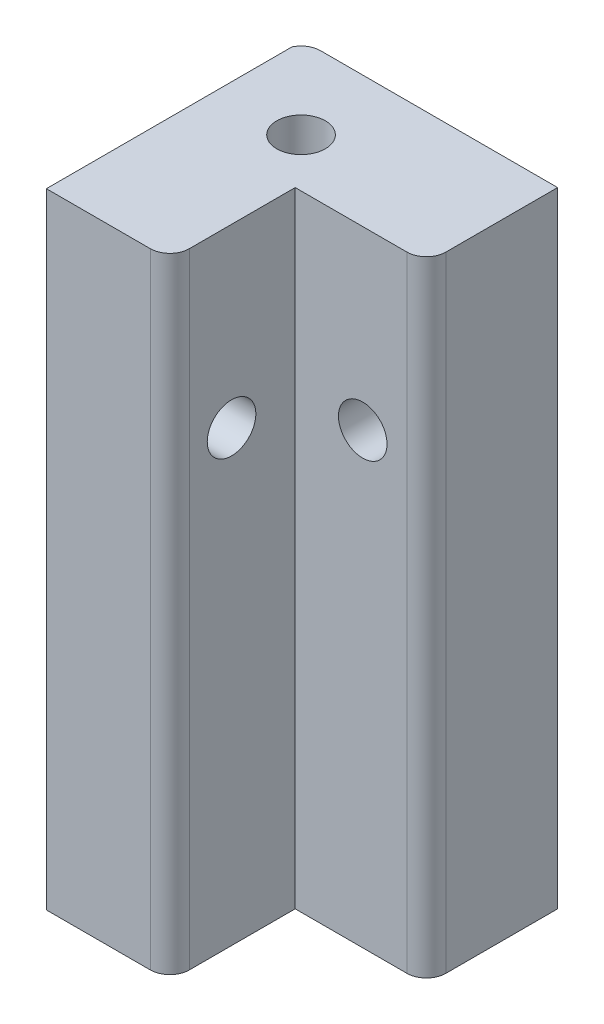
ISO-10303-21;
HEADER;
FILE_DESCRIPTION(('STEP AP214'),'2;1');
FILE_NAME('part.step','',(''),(''),'','','');
FILE_SCHEMA(('AUTOMOTIVE_DESIGN { 1 0 10303 214 1 1 1 1 }'));
ENDSEC;
DATA;
#1=APPLICATION_CONTEXT('core data for automotive mechanical design processes');
#2=APPLICATION_PROTOCOL_DEFINITION('international standard','automotive_design',2000,#1);
#3=PRODUCT_CONTEXT('',#1,'mechanical');
#4=PRODUCT('Part','Part','',(#3));
#5=PRODUCT_RELATED_PRODUCT_CATEGORY('part','',(#4));
#6=PRODUCT_DEFINITION_FORMATION('','',#4);
#7=PRODUCT_DEFINITION_CONTEXT('part definition',#1,'design');
#8=PRODUCT_DEFINITION('design','',#6,#7);
#9=PRODUCT_DEFINITION_SHAPE('','',#8);
#10=(LENGTH_UNIT() NAMED_UNIT(*) SI_UNIT(.MILLI.,.METRE.));
#11=(NAMED_UNIT(*) PLANE_ANGLE_UNIT() SI_UNIT($,.RADIAN.));
#12=(NAMED_UNIT(*) SI_UNIT($,.STERADIAN.) SOLID_ANGLE_UNIT());
#13=UNCERTAINTY_MEASURE_WITH_UNIT(LENGTH_MEASURE(1.E-05),#10,'distance_accuracy_value','');
#14=(GEOMETRIC_REPRESENTATION_CONTEXT(3) GLOBAL_UNCERTAINTY_ASSIGNED_CONTEXT((#13)) GLOBAL_UNIT_ASSIGNED_CONTEXT((#10,
#11,#12)) REPRESENTATION_CONTEXT('',''));
#15=CARTESIAN_POINT('',(0.,0.,0.));
#16=DIRECTION('',(0.,0.,1.));
#17=DIRECTION('',(1.,0.,0.));
#18=AXIS2_PLACEMENT_3D('',#15,#16,#17);
#19=CARTESIAN_POINT('',(4.4,82.5133549546154,-8.5));
#20=DIRECTION('',(-1.,0.,0.));
#21=DIRECTION('',(0.,0.,1.));
#22=AXIS2_PLACEMENT_3D('',#19,#20,#21);
#23=PLANE('',#22);
#24=CARTESIAN_POINT('',(4.4,46.1350000000003,11.55));
#25=DIRECTION('',(-1.,0.,0.));
#26=DIRECTION('',(0.,0.,1.));
#27=AXIS2_PLACEMENT_3D('',#24,#25,#26);
#28=CIRCLE('',#27,2.5);
#29=CARTESIAN_POINT('',(4.4,46.1350000000003,14.05));
#30=VERTEX_POINT('',#29);
#31=EDGE_CURVE('E128',#30,#30,#28,.T.);
#32=ORIENTED_EDGE('',*,*,#31,.T.);
#33=EDGE_LOOP('',(#32));
#34=FACE_BOUND('',#33,.T.);
#35=DIRECTION('',(0.,-1.,0.));
#36=VECTOR('',#35,1.);
#37=CARTESIAN_POINT('',(4.4,64.2700000000025,5.));
#38=LINE('',#37,#36);
#39=CARTESIAN_POINT('',(4.4,64.2700000000025,5.));
#40=VERTEX_POINT('',#39);
#41=CARTESIAN_POINT('',(4.4,0.,4.99999999999999));
#42=VERTEX_POINT('',#41);
#43=EDGE_CURVE('E181',#40,#42,#38,.T.);
#44=ORIENTED_EDGE('',*,*,#43,.F.);
#45=DIRECTION('',(0.,0.,1.));
#46=VECTOR('',#45,1.);
#47=CARTESIAN_POINT('',(4.4,64.2700000000025,-8.50000000000006));
#48=LINE('',#47,#46);
#49=CARTESIAN_POINT('',(4.4,64.2700000000024,15.9));
#50=VERTEX_POINT('',#49);
#51=EDGE_CURVE('E145',#40,#50,#48,.T.);
#52=ORIENTED_EDGE('',*,*,#51,.T.);
#53=DIRECTION('',(0.,1.,0.));
#54=VECTOR('',#53,1.);
#55=CARTESIAN_POINT('',(4.4,82.5133549546154,15.9));
#56=LINE('',#55,#54);
#57=CARTESIAN_POINT('',(4.4,0.,15.9));
#58=VERTEX_POINT('',#57);
#59=EDGE_CURVE('E160',#50,#58,#56,.F.);
#60=ORIENTED_EDGE('',*,*,#59,.T.);
#61=DIRECTION('',(0.,0.,-1.));
#62=VECTOR('',#61,1.);
#63=CARTESIAN_POINT('',(4.4,0.,-8.5));
#64=LINE('',#63,#62);
#65=EDGE_CURVE('E142',#58,#42,#64,.T.);
#66=ORIENTED_EDGE('',*,*,#65,.T.);
#67=EDGE_LOOP('',(#44,#52,#60,#66));
#68=FACE_BOUND('',#67,.T.);
#69=ADVANCED_FACE('F34',(#34,#68),#23,.F.);
#70=CARTESIAN_POINT('',(0.,0.,0.));
#71=DIRECTION('',(0.,-1.,0.));
#72=DIRECTION('',(0.,0.,-1.));
#73=AXIS2_PLACEMENT_3D('',#70,#71,#72);
#74=PLANE('',#73);
#75=DIRECTION('',(0.,0.,-1.));
#76=VECTOR('',#75,1.);
#77=CARTESIAN_POINT('',(-8.29999999999978,0.,17.8999999999997));
#78=LINE('',#77,#76);
#79=CARTESIAN_POINT('',(-8.29999999999978,0.,17.8999999999998));
#80=VERTEX_POINT('',#79);
#81=CARTESIAN_POINT('',(-8.29999999999978,0.,-7.37177978870845));
#82=VERTEX_POINT('',#81);
#83=EDGE_CURVE('E103',#80,#82,#78,.T.);
#84=ORIENTED_EDGE('',*,*,#83,.T.);
#85=CARTESIAN_POINT('',(-6.5,0.,-6.5));
#86=DIRECTION('',(0.,-1.,0.));
#87=DIRECTION('',(0.,0.,-1.));
#88=AXIS2_PLACEMENT_3D('',#85,#86,#87);
#89=CIRCLE('',#88,2.);
#90=CARTESIAN_POINT('',(-6.5,0.,-8.5));
#91=VERTEX_POINT('',#90);
#92=EDGE_CURVE('E162',#82,#91,#89,.T.);
#93=ORIENTED_EDGE('',*,*,#92,.T.);
#94=DIRECTION('',(-1.,0.,0.));
#95=VECTOR('',#94,1.);
#96=CARTESIAN_POINT('',(-8.5,0.,-8.5));
#97=LINE('',#96,#95);
#98=CARTESIAN_POINT('',(17.9,0.,-8.5));
#99=VERTEX_POINT('',#98);
#100=EDGE_CURVE('E137',#99,#91,#97,.T.);
#101=ORIENTED_EDGE('',*,*,#100,.F.);
#102=DIRECTION('',(0.,0.,-1.));
#103=VECTOR('',#102,1.);
#104=CARTESIAN_POINT('',(17.9,0.,-8.5));
#105=LINE('',#104,#103);
#106=CARTESIAN_POINT('',(17.9,0.,2.99999999999999));
#107=VERTEX_POINT('',#106);
#108=EDGE_CURVE('E175',#107,#99,#105,.T.);
#109=ORIENTED_EDGE('',*,*,#108,.F.);
#110=CARTESIAN_POINT('',(15.9,0.,2.99999999999999));
#111=DIRECTION('',(0.,-1.,0.));
#112=DIRECTION('',(0.,0.,-1.));
#113=AXIS2_PLACEMENT_3D('',#110,#111,#112);
#114=CIRCLE('',#113,2.);
#115=CARTESIAN_POINT('',(15.9,0.,4.99999999999999));
#116=VERTEX_POINT('',#115);
#117=EDGE_CURVE('E170',#107,#116,#114,.T.);
#118=ORIENTED_EDGE('',*,*,#117,.T.);
#119=DIRECTION('',(-1.,0.,0.));
#120=VECTOR('',#119,1.);
#121=CARTESIAN_POINT('',(17.9,0.,4.99999999999999));
#122=LINE('',#121,#120);
#123=EDGE_CURVE('E173',#116,#42,#122,.T.);
#124=ORIENTED_EDGE('',*,*,#123,.T.);
#125=ORIENTED_EDGE('',*,*,#65,.F.);
#126=CARTESIAN_POINT('',(2.4,0.,15.9));
#127=DIRECTION('',(0.,-1.,0.));
#128=DIRECTION('',(0.,0.,-1.));
#129=AXIS2_PLACEMENT_3D('',#126,#127,#128);
#130=CIRCLE('',#129,2.);
#131=CARTESIAN_POINT('',(2.4,0.,17.9));
#132=VERTEX_POINT('',#131);
#133=EDGE_CURVE('E126',#58,#132,#130,.T.);
#134=ORIENTED_EDGE('',*,*,#133,.T.);
#135=DIRECTION('',(1.,0.,0.));
#136=VECTOR('',#135,1.);
#137=CARTESIAN_POINT('',(4.4,0.,17.9));
#138=LINE('',#137,#136);
#139=EDGE_CURVE('E117',#80,#132,#138,.T.);
#140=ORIENTED_EDGE('',*,*,#139,.F.);
#141=EDGE_LOOP('',(#84,#93,#101,#109,#118,#124,#125,#134,#140));
#142=FACE_BOUND('',#141,.T.);
#143=CARTESIAN_POINT('',(0.,0.,0.));
#144=DIRECTION('',(0.,1.,0.));
#145=DIRECTION('',(0.,0.,1.));
#146=AXIS2_PLACEMENT_3D('',#143,#144,#145);
#147=CIRCLE('',#146,2.5);
#148=CARTESIAN_POINT('',(0.,0.,2.5));
#149=VERTEX_POINT('',#148);
#150=EDGE_CURVE('E130',#149,#149,#147,.T.);
#151=ORIENTED_EDGE('',*,*,#150,.T.);
#152=EDGE_LOOP('',(#151));
#153=FACE_BOUND('',#152,.T.);
#154=ADVANCED_FACE('F122',(#142,#153),#74,.T.);
#155=CARTESIAN_POINT('',(-8.5,82.5133549546154,-8.5));
#156=DIRECTION('',(0.,0.,1.));
#157=DIRECTION('',(1.,0.,0.));
#158=AXIS2_PLACEMENT_3D('',#155,#156,#157);
#159=PLANE('',#158);
#160=CARTESIAN_POINT('',(11.35,46.1350000000025,-8.5));
#161=DIRECTION('',(0.,0.,-1.));
#162=DIRECTION('',(-1.,0.,0.));
#163=AXIS2_PLACEMENT_3D('',#160,#161,#162);
#164=CIRCLE('',#163,2.5);
#165=CARTESIAN_POINT('',(8.85,46.1350000000025,-8.5));
#166=VERTEX_POINT('',#165);
#167=EDGE_CURVE('E211',#166,#166,#164,.T.);
#168=ORIENTED_EDGE('',*,*,#167,.F.);
#169=EDGE_LOOP('',(#168));
#170=FACE_BOUND('',#169,.T.);
#171=ORIENTED_EDGE('',*,*,#100,.T.);
#172=DIRECTION('',(0.,-1.,0.));
#173=VECTOR('',#172,1.);
#174=CARTESIAN_POINT('',(-6.5,82.5133549546154,-8.5));
#175=LINE('',#174,#173);
#176=CARTESIAN_POINT('',(-6.5,64.2700000000025,-8.5));
#177=VERTEX_POINT('',#176);
#178=EDGE_CURVE('E165',#91,#177,#175,.F.);
#179=ORIENTED_EDGE('',*,*,#178,.T.);
#180=DIRECTION('',(1.,0.,0.));
#181=VECTOR('',#180,1.);
#182=CARTESIAN_POINT('',(-8.49999999999994,64.2700000000025,-8.5));
#183=LINE('',#182,#181);
#184=CARTESIAN_POINT('',(17.9,64.2700000000025,-8.5));
#185=VERTEX_POINT('',#184);
#186=EDGE_CURVE('E141',#177,#185,#183,.T.);
#187=ORIENTED_EDGE('',*,*,#186,.T.);
#188=DIRECTION('',(0.,1.,0.));
#189=VECTOR('',#188,1.);
#190=CARTESIAN_POINT('',(17.9,64.2700000000025,-8.5));
#191=LINE('',#190,#189);
#192=EDGE_CURVE('E195',#99,#185,#191,.T.);
#193=ORIENTED_EDGE('',*,*,#192,.F.);
#194=EDGE_LOOP('',(#171,#179,#187,#193));
#195=FACE_BOUND('',#194,.T.);
#196=ADVANCED_FACE('F233',(#170,#195),#159,.F.);
#197=CARTESIAN_POINT('',(0.,82.5133549546154,0.));
#198=DIRECTION('',(0.,-1.,0.));
#199=DIRECTION('',(0.,0.,-1.));
#200=AXIS2_PLACEMENT_3D('',#197,#198,#199);
#201=CYLINDRICAL_SURFACE('',#200,2.5);
#202=CARTESIAN_POINT('',(0.,64.2700000000025,0.));
#203=DIRECTION('',(0.,-1.,0.));
#204=DIRECTION('',(0.,0.,-1.));
#205=AXIS2_PLACEMENT_3D('',#202,#203,#204);
#206=CIRCLE('',#205,2.5);
#207=CARTESIAN_POINT('',(0.,64.2700000000025,-2.5));
#208=VERTEX_POINT('',#207);
#209=EDGE_CURVE('E140',#208,#208,#206,.T.);
#210=ORIENTED_EDGE('',*,*,#209,.F.);
#211=EDGE_LOOP('',(#210));
#212=FACE_BOUND('',#211,.T.);
#213=ORIENTED_EDGE('',*,*,#150,.F.);
#214=EDGE_LOOP('',(#213));
#215=FACE_BOUND('',#214,.T.);
#216=ADVANCED_FACE('F237',(#212,#215),#201,.F.);
#217=CARTESIAN_POINT('',(-5.03553390591879,64.2700000000017,230.321777316259));
#218=DIRECTION('',(0.,-1.,0.));
#219=DIRECTION('',(-1.,0.,0.));
#220=AXIS2_PLACEMENT_3D('',#217,#218,#219);
#221=PLANE('',#220);
#222=ORIENTED_EDGE('',*,*,#209,.T.);
#223=EDGE_LOOP('',(#222));
#224=FACE_BOUND('',#223,.T.);
#225=CARTESIAN_POINT('',(-6.5,64.2700000000025,-6.5));
#226=DIRECTION('',(0.,-1.,0.));
#227=DIRECTION('',(0.,0.,-1.));
#228=AXIS2_PLACEMENT_3D('',#225,#226,#227);
#229=CIRCLE('',#228,2.);
#230=CARTESIAN_POINT('',(-8.30000000000003,64.2700000000025,-7.37177978870807));
#231=VERTEX_POINT('',#230);
#232=EDGE_CURVE('E154',#177,#231,#229,.F.);
#233=ORIENTED_EDGE('',*,*,#232,.T.);
#234=DIRECTION('',(0.,0.,-1.));
#235=VECTOR('',#234,1.);
#236=CARTESIAN_POINT('',(-8.3,64.2700000000024,17.9));
#237=LINE('',#236,#235);
#238=CARTESIAN_POINT('',(-8.3,64.2700000000024,17.9));
#239=VERTEX_POINT('',#238);
#240=EDGE_CURVE('E50',#239,#231,#237,.T.);
#241=ORIENTED_EDGE('',*,*,#240,.F.);
#242=DIRECTION('',(-1.,0.,0.));
#243=VECTOR('',#242,1.);
#244=CARTESIAN_POINT('',(-8.5,64.2700000000024,17.9));
#245=LINE('',#244,#243);
#246=CARTESIAN_POINT('',(2.4,64.2700000000025,17.9));
#247=VERTEX_POINT('',#246);
#248=EDGE_CURVE('E120',#247,#239,#245,.T.);
#249=ORIENTED_EDGE('',*,*,#248,.F.);
#250=CARTESIAN_POINT('',(2.4,64.2700000000024,15.9));
#251=DIRECTION('',(0.,-1.,0.));
#252=DIRECTION('',(0.,0.,-1.));
#253=AXIS2_PLACEMENT_3D('',#250,#251,#252);
#254=CIRCLE('',#253,2.);
#255=EDGE_CURVE('E157',#247,#50,#254,.F.);
#256=ORIENTED_EDGE('',*,*,#255,.T.);
#257=ORIENTED_EDGE('',*,*,#51,.F.);
#258=DIRECTION('',(-1.,0.,0.));
#259=VECTOR('',#258,1.);
#260=CARTESIAN_POINT('',(17.9,64.2700000000025,5.));
#261=LINE('',#260,#259);
#262=CARTESIAN_POINT('',(15.9,64.2700000000025,5.));
#263=VERTEX_POINT('',#262);
#264=EDGE_CURVE('E133',#263,#40,#261,.T.);
#265=ORIENTED_EDGE('',*,*,#264,.F.);
#266=CARTESIAN_POINT('',(15.9,64.2700000000025,3.));
#267=DIRECTION('',(0.,-1.,0.));
#268=DIRECTION('',(0.,0.,-1.));
#269=AXIS2_PLACEMENT_3D('',#266,#267,#268);
#270=CIRCLE('',#269,2.);
#271=CARTESIAN_POINT('',(17.9,64.2700000000025,3.));
#272=VERTEX_POINT('',#271);
#273=EDGE_CURVE('E11',#263,#272,#270,.F.);
#274=ORIENTED_EDGE('',*,*,#273,.T.);
#275=DIRECTION('',(0.,0.,1.));
#276=VECTOR('',#275,1.);
#277=CARTESIAN_POINT('',(17.9,64.2700000000025,-8.5));
#278=LINE('',#277,#276);
#279=EDGE_CURVE('E189',#185,#272,#278,.T.);
#280=ORIENTED_EDGE('',*,*,#279,.F.);
#281=ORIENTED_EDGE('',*,*,#186,.F.);
#282=EDGE_LOOP('',(#233,#241,#249,#256,#257,#265,#274,#280,#281));
#283=FACE_BOUND('',#282,.T.);
#284=ADVANCED_FACE('F187',(#224,#283),#221,.F.);
#285=CARTESIAN_POINT('',(0.,0.,17.9));
#286=DIRECTION('',(0.,0.,-1.));
#287=DIRECTION('',(-1.,0.,0.));
#288=AXIS2_PLACEMENT_3D('',#285,#286,#287);
#289=PLANE('',#288);
#290=ORIENTED_EDGE('',*,*,#248,.T.);
#291=DIRECTION('',(0.,1.,0.));
#292=VECTOR('',#291,1.);
#293=CARTESIAN_POINT('',(-8.29999999999969,-25.2725711728933,17.8999999999997));
#294=LINE('',#293,#292);
#295=EDGE_CURVE('E107',#80,#239,#294,.T.);
#296=ORIENTED_EDGE('',*,*,#295,.F.);
#297=ORIENTED_EDGE('',*,*,#139,.T.);
#298=DIRECTION('',(0.,1.,0.));
#299=VECTOR('',#298,1.);
#300=CARTESIAN_POINT('',(2.4,0.,17.9));
#301=LINE('',#300,#299);
#302=EDGE_CURVE('E152',#132,#247,#301,.T.);
#303=ORIENTED_EDGE('',*,*,#302,.T.);
#304=EDGE_LOOP('',(#290,#296,#297,#303));
#305=FACE_BOUND('',#304,.T.);
#306=ADVANCED_FACE('F115',(#305),#289,.F.);
#307=CARTESIAN_POINT('',(2.4,0.,15.9));
#308=DIRECTION('',(0.,1.,0.));
#309=DIRECTION('',(0.,0.,1.));
#310=AXIS2_PLACEMENT_3D('',#307,#308,#309);
#311=CYLINDRICAL_SURFACE('',#310,2.);
#312=ORIENTED_EDGE('',*,*,#133,.F.);
#313=ORIENTED_EDGE('',*,*,#59,.F.);
#314=ORIENTED_EDGE('',*,*,#255,.F.);
#315=ORIENTED_EDGE('',*,*,#302,.F.);
#316=EDGE_LOOP('',(#312,#313,#314,#315));
#317=FACE_BOUND('',#316,.T.);
#318=ADVANCED_FACE('F205',(#317),#311,.T.);
#319=CARTESIAN_POINT('',(-6.5,82.5133549546154,-6.5));
#320=DIRECTION('',(0.,-1.,0.));
#321=DIRECTION('',(0.,0.,-1.));
#322=AXIS2_PLACEMENT_3D('',#319,#320,#321);
#323=CYLINDRICAL_SURFACE('',#322,2.);
#324=DIRECTION('',(0.,1.,0.));
#325=VECTOR('',#324,1.);
#326=CARTESIAN_POINT('',(-8.29999999999969,-25.2725711728932,-7.37177978870845));
#327=LINE('',#326,#325);
#328=EDGE_CURVE('E108',#82,#231,#327,.T.);
#329=ORIENTED_EDGE('',*,*,#328,.T.);
#330=ORIENTED_EDGE('',*,*,#232,.F.);
#331=ORIENTED_EDGE('',*,*,#178,.F.);
#332=ORIENTED_EDGE('',*,*,#92,.F.);
#333=EDGE_LOOP('',(#329,#330,#331,#332));
#334=FACE_BOUND('',#333,.T.);
#335=ADVANCED_FACE('F245',(#334),#323,.T.);
#336=CARTESIAN_POINT('',(5.,46.1350000000003,11.55));
#337=DIRECTION('',(-1.,0.,0.));
#338=DIRECTION('',(0.,0.,1.));
#339=AXIS2_PLACEMENT_3D('',#336,#337,#338);
#340=CYLINDRICAL_SURFACE('',#339,2.5);
#341=CARTESIAN_POINT('',(-8.29999999999994,46.1350000000003,11.55));
#342=DIRECTION('',(1.,0.,0.));
#343=DIRECTION('',(0.,1.,0.));
#344=AXIS2_PLACEMENT_3D('',#341,#342,#343);
#345=CIRCLE('',#344,2.5);
#346=CARTESIAN_POINT('',(-8.29999999999994,48.6350000000003,11.55));
#347=VERTEX_POINT('',#346);
#348=EDGE_CURVE('E38',#347,#347,#345,.F.);
#349=ORIENTED_EDGE('',*,*,#348,.T.);
#350=EDGE_LOOP('',(#349));
#351=FACE_BOUND('',#350,.T.);
#352=ORIENTED_EDGE('',*,*,#31,.F.);
#353=EDGE_LOOP('',(#352));
#354=FACE_BOUND('',#353,.T.);
#355=ADVANCED_FACE('F218',(#351,#354),#340,.F.);
#356=CARTESIAN_POINT('',(17.9,64.2700000000025,5.));
#357=DIRECTION('',(0.,0.,-1.));
#358=DIRECTION('',(0.,1.,0.));
#359=AXIS2_PLACEMENT_3D('',#356,#357,#358);
#360=PLANE('',#359);
#361=CARTESIAN_POINT('',(11.35,46.1350000000025,5.));
#362=DIRECTION('',(0.,0.,-1.));
#363=DIRECTION('',(-1.,0.,0.));
#364=AXIS2_PLACEMENT_3D('',#361,#362,#363);
#365=CIRCLE('',#364,2.5);
#366=CARTESIAN_POINT('',(8.85,46.1350000000025,5.));
#367=VERTEX_POINT('',#366);
#368=EDGE_CURVE('E201',#367,#367,#365,.T.);
#369=ORIENTED_EDGE('',*,*,#368,.T.);
#370=EDGE_LOOP('',(#369));
#371=FACE_BOUND('',#370,.T.);
#372=ORIENTED_EDGE('',*,*,#123,.F.);
#373=DIRECTION('',(0.,-1.,0.));
#374=VECTOR('',#373,1.);
#375=CARTESIAN_POINT('',(15.9,64.2700000000025,5.));
#376=LINE('',#375,#374);
#377=EDGE_CURVE('E43',#116,#263,#376,.F.);
#378=ORIENTED_EDGE('',*,*,#377,.T.);
#379=ORIENTED_EDGE('',*,*,#264,.T.);
#380=ORIENTED_EDGE('',*,*,#43,.T.);
#381=EDGE_LOOP('',(#372,#378,#379,#380));
#382=FACE_BOUND('',#381,.T.);
#383=ADVANCED_FACE('F179',(#371,#382),#360,.F.);
#384=CARTESIAN_POINT('',(17.9,0.,0.));
#385=DIRECTION('',(-1.,0.,0.));
#386=DIRECTION('',(0.,0.,1.));
#387=AXIS2_PLACEMENT_3D('',#384,#385,#386);
#388=PLANE('',#387);
#389=ORIENTED_EDGE('',*,*,#279,.T.);
#390=DIRECTION('',(0.,-1.,0.));
#391=VECTOR('',#390,1.);
#392=CARTESIAN_POINT('',(17.9,0.,2.99999999999999));
#393=LINE('',#392,#391);
#394=EDGE_CURVE('E167',#272,#107,#393,.T.);
#395=ORIENTED_EDGE('',*,*,#394,.T.);
#396=ORIENTED_EDGE('',*,*,#108,.T.);
#397=ORIENTED_EDGE('',*,*,#192,.T.);
#398=EDGE_LOOP('',(#389,#395,#396,#397));
#399=FACE_BOUND('',#398,.T.);
#400=ADVANCED_FACE('F193',(#399),#388,.F.);
#401=CARTESIAN_POINT('',(11.35,46.1350000000025,5.));
#402=DIRECTION('',(0.,0.,-1.));
#403=DIRECTION('',(-1.,0.,0.));
#404=AXIS2_PLACEMENT_3D('',#401,#402,#403);
#405=CYLINDRICAL_SURFACE('',#404,2.5);
#406=ORIENTED_EDGE('',*,*,#368,.F.);
#407=EDGE_LOOP('',(#406));
#408=FACE_BOUND('',#407,.T.);
#409=ORIENTED_EDGE('',*,*,#167,.T.);
#410=EDGE_LOOP('',(#409));
#411=FACE_BOUND('',#410,.T.);
#412=ADVANCED_FACE('F225',(#408,#411),#405,.F.);
#413=CARTESIAN_POINT('',(15.9,0.,2.99999999999999));
#414=DIRECTION('',(0.,-1.,0.));
#415=DIRECTION('',(0.,0.,-1.));
#416=AXIS2_PLACEMENT_3D('',#413,#414,#415);
#417=CYLINDRICAL_SURFACE('',#416,2.);
#418=ORIENTED_EDGE('',*,*,#273,.F.);
#419=ORIENTED_EDGE('',*,*,#377,.F.);
#420=ORIENTED_EDGE('',*,*,#117,.F.);
#421=ORIENTED_EDGE('',*,*,#394,.F.);
#422=EDGE_LOOP('',(#418,#419,#420,#421));
#423=FACE_BOUND('',#422,.T.);
#424=ADVANCED_FACE('F36',(#423),#417,.T.);
#425=CARTESIAN_POINT('',(-8.29999999999969,-25.2725711728933,17.8999999999997));
#426=DIRECTION('',(1.,0.,0.));
#427=DIRECTION('',(0.,1.,0.));
#428=AXIS2_PLACEMENT_3D('',#425,#426,#427);
#429=PLANE('',#428);
#430=ORIENTED_EDGE('',*,*,#295,.T.);
#431=ORIENTED_EDGE('',*,*,#240,.T.);
#432=ORIENTED_EDGE('',*,*,#328,.F.);
#433=ORIENTED_EDGE('',*,*,#83,.F.);
#434=EDGE_LOOP('',(#430,#431,#432,#433));
#435=FACE_BOUND('',#434,.T.);
#436=ORIENTED_EDGE('',*,*,#348,.F.);
#437=EDGE_LOOP('',(#436));
#438=FACE_BOUND('',#437,.T.);
#439=ADVANCED_FACE('F105',(#435,#438),#429,.F.);
#440=CLOSED_SHELL('',(#69,#154,#196,#216,#284,#306,#318,#335,#355,#383,#400,#412,#424,#439));
#441=MANIFOLD_SOLID_BREP('B2',#440);
#442=ADVANCED_BREP_SHAPE_REPRESENTATION('',(#18,#441),#14);
#443=SHAPE_DEFINITION_REPRESENTATION(#9,#442);
ENDSEC;
END-ISO-10303-21;
